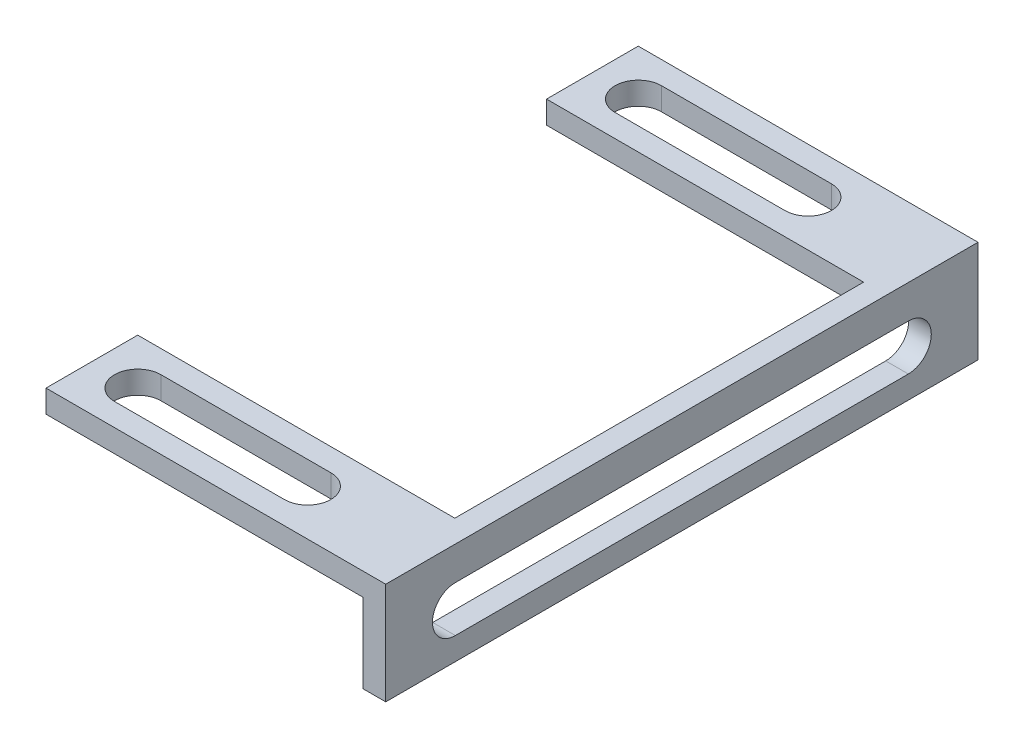
ISO-10303-21;
HEADER;
FILE_DESCRIPTION(('STEP AP214'),'2;1');
FILE_NAME('part.step','',(''),(''),'','','');
FILE_SCHEMA(('AUTOMOTIVE_DESIGN { 1 0 10303 214 1 1 1 1 }'));
ENDSEC;
DATA;
#1=APPLICATION_CONTEXT('core data for automotive mechanical design processes');
#2=APPLICATION_PROTOCOL_DEFINITION('international standard','automotive_design',2000,#1);
#3=PRODUCT_CONTEXT('',#1,'mechanical');
#4=PRODUCT('Part','Part','',(#3));
#5=PRODUCT_RELATED_PRODUCT_CATEGORY('part','',(#4));
#6=PRODUCT_DEFINITION_FORMATION('','',#4);
#7=PRODUCT_DEFINITION_CONTEXT('part definition',#1,'design');
#8=PRODUCT_DEFINITION('design','',#6,#7);
#9=PRODUCT_DEFINITION_SHAPE('','',#8);
#10=(LENGTH_UNIT() NAMED_UNIT(*) SI_UNIT(.MILLI.,.METRE.));
#11=(NAMED_UNIT(*) PLANE_ANGLE_UNIT() SI_UNIT($,.RADIAN.));
#12=(NAMED_UNIT(*) SI_UNIT($,.STERADIAN.) SOLID_ANGLE_UNIT());
#13=UNCERTAINTY_MEASURE_WITH_UNIT(LENGTH_MEASURE(1.E-05),#10,'distance_accuracy_value','');
#14=(GEOMETRIC_REPRESENTATION_CONTEXT(3) GLOBAL_UNCERTAINTY_ASSIGNED_CONTEXT((#13)) GLOBAL_UNIT_ASSIGNED_CONTEXT((#10,
#11,#12)) REPRESENTATION_CONTEXT('',''));
#15=CARTESIAN_POINT('',(0.,0.,0.));
#16=DIRECTION('',(0.,0.,1.));
#17=DIRECTION('',(1.,0.,0.));
#18=AXIS2_PLACEMENT_3D('',#15,#16,#17);
#19=CARTESIAN_POINT('',(0.,0.,-44.2));
#20=DIRECTION('',(0.,0.,-1.));
#21=DIRECTION('',(-1.,0.,0.));
#22=AXIS2_PLACEMENT_3D('',#19,#20,#21);
#23=PLANE('',#22);
#24=DIRECTION('',(0.,-1.,0.));
#25=VECTOR('',#24,1.);
#26=CARTESIAN_POINT('',(28.,2.,-44.2));
#27=LINE('',#26,#25);
#28=CARTESIAN_POINT('',(28.,2.,-44.2));
#29=VERTEX_POINT('',#28);
#30=CARTESIAN_POINT('',(28.,0.,-44.2));
#31=VERTEX_POINT('',#30);
#32=EDGE_CURVE('E57',#29,#31,#27,.T.);
#33=ORIENTED_EDGE('',*,*,#32,.F.);
#34=DIRECTION('',(-1.,0.,0.));
#35=VECTOR('',#34,1.);
#36=CARTESIAN_POINT('',(0.,2.,-44.2));
#37=LINE('',#36,#35);
#38=CARTESIAN_POINT('',(0.,2.,-44.2));
#39=VERTEX_POINT('',#38);
#40=EDGE_CURVE('E198',#29,#39,#37,.T.);
#41=ORIENTED_EDGE('',*,*,#40,.T.);
#42=DIRECTION('',(0.,1.,0.));
#43=VECTOR('',#42,1.);
#44=CARTESIAN_POINT('',(0.,0.,-44.2));
#45=LINE('',#44,#43);
#46=CARTESIAN_POINT('',(0.,0.,-44.2));
#47=VERTEX_POINT('',#46);
#48=EDGE_CURVE('E207',#47,#39,#45,.T.);
#49=ORIENTED_EDGE('',*,*,#48,.F.);
#50=DIRECTION('',(-1.,0.,0.));
#51=VECTOR('',#50,1.);
#52=CARTESIAN_POINT('',(0.,0.,-44.2));
#53=LINE('',#52,#51);
#54=EDGE_CURVE('E197',#31,#47,#53,.T.);
#55=ORIENTED_EDGE('',*,*,#54,.F.);
#56=EDGE_LOOP('',(#33,#41,#49,#55));
#57=FACE_BOUND('',#56,.T.);
#58=ADVANCED_FACE('F41',(#57),#23,.F.);
#59=CARTESIAN_POINT('',(0.,0.,-8.1));
#60=DIRECTION('',(0.,0.,1.));
#61=DIRECTION('',(1.,0.,0.));
#62=AXIS2_PLACEMENT_3D('',#59,#60,#61);
#63=PLANE('',#62);
#64=DIRECTION('',(0.,-1.,0.));
#65=VECTOR('',#64,1.);
#66=CARTESIAN_POINT('',(28.,2.,-8.1));
#67=LINE('',#66,#65);
#68=CARTESIAN_POINT('',(28.,2.,-8.1));
#69=VERTEX_POINT('',#68);
#70=CARTESIAN_POINT('',(28.,0.,-8.1));
#71=VERTEX_POINT('',#70);
#72=EDGE_CURVE('E193',#69,#71,#67,.T.);
#73=ORIENTED_EDGE('',*,*,#72,.T.);
#74=DIRECTION('',(1.,0.,0.));
#75=VECTOR('',#74,1.);
#76=CARTESIAN_POINT('',(0.,0.,-8.1));
#77=LINE('',#76,#75);
#78=CARTESIAN_POINT('',(0.,0.,-8.1));
#79=VERTEX_POINT('',#78);
#80=EDGE_CURVE('E188',#79,#71,#77,.T.);
#81=ORIENTED_EDGE('',*,*,#80,.F.);
#82=DIRECTION('',(0.,1.,0.));
#83=VECTOR('',#82,1.);
#84=CARTESIAN_POINT('',(0.,0.,-8.1));
#85=LINE('',#84,#83);
#86=CARTESIAN_POINT('',(0.,2.,-8.1));
#87=VERTEX_POINT('',#86);
#88=EDGE_CURVE('E191',#79,#87,#85,.T.);
#89=ORIENTED_EDGE('',*,*,#88,.T.);
#90=DIRECTION('',(1.,0.,0.));
#91=VECTOR('',#90,1.);
#92=CARTESIAN_POINT('',(0.,2.,-8.1));
#93=LINE('',#92,#91);
#94=EDGE_CURVE('E65',#87,#69,#93,.T.);
#95=ORIENTED_EDGE('',*,*,#94,.T.);
#96=EDGE_LOOP('',(#73,#81,#89,#95));
#97=FACE_BOUND('',#96,.T.);
#98=ADVANCED_FACE('F190',(#97),#63,.F.);
#99=CARTESIAN_POINT('',(0.,2.,0.));
#100=DIRECTION('',(1.,0.,0.));
#101=DIRECTION('',(0.,0.,-1.));
#102=AXIS2_PLACEMENT_3D('',#99,#100,#101);
#103=PLANE('',#102);
#104=ORIENTED_EDGE('',*,*,#48,.T.);
#105=DIRECTION('',(0.,0.,-1.));
#106=VECTOR('',#105,1.);
#107=CARTESIAN_POINT('',(0.,2.,0.));
#108=LINE('',#107,#106);
#109=CARTESIAN_POINT('',(0.,2.,-52.3));
#110=VERTEX_POINT('',#109);
#111=EDGE_CURVE('E247',#39,#110,#108,.T.);
#112=ORIENTED_EDGE('',*,*,#111,.T.);
#113=DIRECTION('',(0.,1.,0.));
#114=VECTOR('',#113,1.);
#115=CARTESIAN_POINT('',(0.,2.,-52.3));
#116=LINE('',#115,#114);
#117=CARTESIAN_POINT('',(0.,0.,-52.3));
#118=VERTEX_POINT('',#117);
#119=EDGE_CURVE('E253',#118,#110,#116,.T.);
#120=ORIENTED_EDGE('',*,*,#119,.F.);
#121=DIRECTION('',(0.,0.,1.));
#122=VECTOR('',#121,1.);
#123=CARTESIAN_POINT('',(0.,0.,0.));
#124=LINE('',#123,#122);
#125=EDGE_CURVE('E214',#47,#118,#124,.F.);
#126=ORIENTED_EDGE('',*,*,#125,.F.);
#127=EDGE_LOOP('',(#104,#112,#120,#126));
#128=FACE_BOUND('',#127,.T.);
#129=ADVANCED_FACE('F399',(#128),#103,.F.);
#130=CARTESIAN_POINT('',(0.,0.,0.));
#131=DIRECTION('',(0.,1.,0.));
#132=DIRECTION('',(0.,0.,1.));
#133=AXIS2_PLACEMENT_3D('',#130,#131,#132);
#134=PLANE('',#133);
#135=DIRECTION('',(1.,0.,0.));
#136=VECTOR('',#135,1.);
#137=CARTESIAN_POINT('',(0.,0.,-50.3));
#138=LINE('',#137,#136);
#139=CARTESIAN_POINT('',(4.05,0.,-50.3));
#140=VERTEX_POINT('',#139);
#141=CARTESIAN_POINT('',(19.05,0.,-50.3));
#142=VERTEX_POINT('',#141);
#143=EDGE_CURVE('E226',#140,#142,#138,.T.);
#144=ORIENTED_EDGE('',*,*,#143,.F.);
#145=CARTESIAN_POINT('',(4.05,0.,-48.25));
#146=DIRECTION('',(0.,1.,0.));
#147=DIRECTION('',(0.,0.,1.));
#148=AXIS2_PLACEMENT_3D('',#145,#146,#147);
#149=CIRCLE('',#148,2.05);
#150=CARTESIAN_POINT('',(4.05,0.,-46.2));
#151=VERTEX_POINT('',#150);
#152=EDGE_CURVE('E232',#151,#140,#149,.F.);
#153=ORIENTED_EDGE('',*,*,#152,.F.);
#154=DIRECTION('',(1.,0.,0.));
#155=VECTOR('',#154,1.);
#156=CARTESIAN_POINT('',(0.,0.,-46.2));
#157=LINE('',#156,#155);
#158=CARTESIAN_POINT('',(19.05,0.,-46.2));
#159=VERTEX_POINT('',#158);
#160=EDGE_CURVE('E236',#151,#159,#157,.T.);
#161=ORIENTED_EDGE('',*,*,#160,.T.);
#162=CARTESIAN_POINT('',(19.05,0.,-48.25));
#163=DIRECTION('',(0.,1.,0.));
#164=DIRECTION('',(0.,0.,1.));
#165=AXIS2_PLACEMENT_3D('',#162,#163,#164);
#166=CIRCLE('',#165,2.05);
#167=EDGE_CURVE('E231',#142,#159,#166,.F.);
#168=ORIENTED_EDGE('',*,*,#167,.F.);
#169=EDGE_LOOP('',(#144,#153,#161,#168));
#170=FACE_BOUND('',#169,.T.);
#171=DIRECTION('',(0.,0.,1.));
#172=VECTOR('',#171,1.);
#173=CARTESIAN_POINT('',(28.,0.,0.));
#174=LINE('',#173,#172);
#175=CARTESIAN_POINT('',(28.,0.,-52.3));
#176=VERTEX_POINT('',#175);
#177=EDGE_CURVE('E216',#31,#176,#174,.F.);
#178=ORIENTED_EDGE('',*,*,#177,.F.);
#179=ORIENTED_EDGE('',*,*,#54,.T.);
#180=ORIENTED_EDGE('',*,*,#125,.T.);
#181=DIRECTION('',(1.,0.,0.));
#182=VECTOR('',#181,1.);
#183=CARTESIAN_POINT('',(0.,0.,-52.3));
#184=LINE('',#183,#182);
#185=EDGE_CURVE('E223',#118,#176,#184,.T.);
#186=ORIENTED_EDGE('',*,*,#185,.T.);
#187=EDGE_LOOP('',(#178,#179,#180,#186));
#188=FACE_BOUND('',#187,.T.);
#189=ADVANCED_FACE('F403',(#170,#188),#134,.F.);
#190=CARTESIAN_POINT('',(4.05,2.,-4.05));
#191=DIRECTION('',(0.,1.,0.));
#192=DIRECTION('',(0.,0.,1.));
#193=AXIS2_PLACEMENT_3D('',#190,#191,#192);
#194=CYLINDRICAL_SURFACE('',#193,2.05);
#195=DIRECTION('',(0.,1.,0.));
#196=VECTOR('',#195,1.);
#197=CARTESIAN_POINT('',(4.05,2.,-2.));
#198=LINE('',#197,#196);
#199=CARTESIAN_POINT('',(4.05,0.,-2.));
#200=VERTEX_POINT('',#199);
#201=CARTESIAN_POINT('',(4.05,2.,-2.));
#202=VERTEX_POINT('',#201);
#203=EDGE_CURVE('E11',#200,#202,#198,.T.);
#204=ORIENTED_EDGE('',*,*,#203,.F.);
#205=CARTESIAN_POINT('',(4.05,0.,-4.05));
#206=DIRECTION('',(0.,1.,0.));
#207=DIRECTION('',(0.,0.,1.));
#208=AXIS2_PLACEMENT_3D('',#205,#206,#207);
#209=CIRCLE('',#208,2.05);
#210=CARTESIAN_POINT('',(4.05,0.,-6.1));
#211=VERTEX_POINT('',#210);
#212=EDGE_CURVE('E248',#211,#200,#209,.T.);
#213=ORIENTED_EDGE('',*,*,#212,.F.);
#214=DIRECTION('',(0.,1.,0.));
#215=VECTOR('',#214,1.);
#216=CARTESIAN_POINT('',(4.05,2.,-6.1));
#217=LINE('',#216,#215);
#218=CARTESIAN_POINT('',(4.05,2.,-6.1));
#219=VERTEX_POINT('',#218);
#220=EDGE_CURVE('E50',#211,#219,#217,.T.);
#221=ORIENTED_EDGE('',*,*,#220,.T.);
#222=CARTESIAN_POINT('',(4.05,2.,-4.05));
#223=DIRECTION('',(0.,1.,0.));
#224=DIRECTION('',(0.,0.,1.));
#225=AXIS2_PLACEMENT_3D('',#222,#223,#224);
#226=CIRCLE('',#225,2.05);
#227=EDGE_CURVE('E273',#219,#202,#226,.T.);
#228=ORIENTED_EDGE('',*,*,#227,.T.);
#229=EDGE_LOOP('',(#204,#213,#221,#228));
#230=FACE_BOUND('',#229,.T.);
#231=ADVANCED_FACE('F272',(#230),#194,.F.);
#232=CARTESIAN_POINT('',(0.,2.,-6.1));
#233=DIRECTION('',(0.,0.,1.));
#234=DIRECTION('',(1.,0.,0.));
#235=AXIS2_PLACEMENT_3D('',#232,#233,#234);
#236=PLANE('',#235);
#237=ORIENTED_EDGE('',*,*,#220,.F.);
#238=DIRECTION('',(1.,0.,0.));
#239=VECTOR('',#238,1.);
#240=CARTESIAN_POINT('',(0.,0.,-6.1));
#241=LINE('',#240,#239);
#242=CARTESIAN_POINT('',(19.05,0.,-6.1));
#243=VERTEX_POINT('',#242);
#244=EDGE_CURVE('E244',#211,#243,#241,.T.);
#245=ORIENTED_EDGE('',*,*,#244,.T.);
#246=DIRECTION('',(0.,1.,0.));
#247=VECTOR('',#246,1.);
#248=CARTESIAN_POINT('',(19.05,2.,-6.1));
#249=LINE('',#248,#247);
#250=CARTESIAN_POINT('',(19.05,2.,-6.1));
#251=VERTEX_POINT('',#250);
#252=EDGE_CURVE('E266',#243,#251,#249,.T.);
#253=ORIENTED_EDGE('',*,*,#252,.T.);
#254=DIRECTION('',(1.,0.,0.));
#255=VECTOR('',#254,1.);
#256=CARTESIAN_POINT('',(0.,2.,-6.1));
#257=LINE('',#256,#255);
#258=EDGE_CURVE('E221',#219,#251,#257,.T.);
#259=ORIENTED_EDGE('',*,*,#258,.F.);
#260=EDGE_LOOP('',(#237,#245,#253,#259));
#261=FACE_BOUND('',#260,.T.);
#262=ADVANCED_FACE('F285',(#261),#236,.T.);
#263=CARTESIAN_POINT('',(19.05,2.,-4.05));
#264=DIRECTION('',(0.,1.,0.));
#265=DIRECTION('',(0.,0.,1.));
#266=AXIS2_PLACEMENT_3D('',#263,#264,#265);
#267=CYLINDRICAL_SURFACE('',#266,2.05);
#268=ORIENTED_EDGE('',*,*,#252,.F.);
#269=CARTESIAN_POINT('',(19.05,0.,-4.05));
#270=DIRECTION('',(0.,1.,0.));
#271=DIRECTION('',(0.,0.,1.));
#272=AXIS2_PLACEMENT_3D('',#269,#270,#271);
#273=CIRCLE('',#272,2.05);
#274=CARTESIAN_POINT('',(19.05,0.,-2.));
#275=VERTEX_POINT('',#274);
#276=EDGE_CURVE('E235',#275,#243,#273,.T.);
#277=ORIENTED_EDGE('',*,*,#276,.F.);
#278=DIRECTION('',(0.,1.,0.));
#279=VECTOR('',#278,1.);
#280=CARTESIAN_POINT('',(19.05,2.,-2.));
#281=LINE('',#280,#279);
#282=CARTESIAN_POINT('',(19.05,2.,-2.));
#283=VERTEX_POINT('',#282);
#284=EDGE_CURVE('E45',#275,#283,#281,.T.);
#285=ORIENTED_EDGE('',*,*,#284,.T.);
#286=CARTESIAN_POINT('',(19.05,2.,-4.05));
#287=DIRECTION('',(0.,1.,0.));
#288=DIRECTION('',(0.,0.,1.));
#289=AXIS2_PLACEMENT_3D('',#286,#287,#288);
#290=CIRCLE('',#289,2.05);
#291=EDGE_CURVE('E289',#283,#251,#290,.T.);
#292=ORIENTED_EDGE('',*,*,#291,.T.);
#293=EDGE_LOOP('',(#268,#277,#285,#292));
#294=FACE_BOUND('',#293,.T.);
#295=ADVANCED_FACE('F290',(#294),#267,.F.);
#296=CARTESIAN_POINT('',(0.,2.,-46.2));
#297=DIRECTION('',(0.,0.,1.));
#298=DIRECTION('',(1.,0.,0.));
#299=AXIS2_PLACEMENT_3D('',#296,#297,#298);
#300=PLANE('',#299);
#301=DIRECTION('',(0.,1.,0.));
#302=VECTOR('',#301,1.);
#303=CARTESIAN_POINT('',(19.05,2.,-46.2));
#304=LINE('',#303,#302);
#305=CARTESIAN_POINT('',(19.05,2.,-46.2));
#306=VERTEX_POINT('',#305);
#307=EDGE_CURVE('E263',#159,#306,#304,.T.);
#308=ORIENTED_EDGE('',*,*,#307,.F.);
#309=ORIENTED_EDGE('',*,*,#160,.F.);
#310=DIRECTION('',(0.,1.,0.));
#311=VECTOR('',#310,1.);
#312=CARTESIAN_POINT('',(4.05,2.,-46.2));
#313=LINE('',#312,#311);
#314=CARTESIAN_POINT('',(4.05,2.,-46.2));
#315=VERTEX_POINT('',#314);
#316=EDGE_CURVE('E261',#151,#315,#313,.T.);
#317=ORIENTED_EDGE('',*,*,#316,.T.);
#318=DIRECTION('',(1.,0.,0.));
#319=VECTOR('',#318,1.);
#320=CARTESIAN_POINT('',(0.,2.,-46.2));
#321=LINE('',#320,#319);
#322=EDGE_CURVE('E295',#315,#306,#321,.T.);
#323=ORIENTED_EDGE('',*,*,#322,.T.);
#324=EDGE_LOOP('',(#308,#309,#317,#323));
#325=FACE_BOUND('',#324,.T.);
#326=ADVANCED_FACE('F472',(#325),#300,.F.);
#327=CARTESIAN_POINT('',(4.05,2.,-48.25));
#328=DIRECTION('',(0.,1.,0.));
#329=DIRECTION('',(0.,0.,1.));
#330=AXIS2_PLACEMENT_3D('',#327,#328,#329);
#331=CYLINDRICAL_SURFACE('',#330,2.05);
#332=ORIENTED_EDGE('',*,*,#316,.F.);
#333=ORIENTED_EDGE('',*,*,#152,.T.);
#334=DIRECTION('',(0.,1.,0.));
#335=VECTOR('',#334,1.);
#336=CARTESIAN_POINT('',(4.05,2.,-50.3));
#337=LINE('',#336,#335);
#338=CARTESIAN_POINT('',(4.05,2.,-50.3));
#339=VERTEX_POINT('',#338);
#340=EDGE_CURVE('E259',#140,#339,#337,.T.);
#341=ORIENTED_EDGE('',*,*,#340,.T.);
#342=CARTESIAN_POINT('',(4.05,2.,-48.25));
#343=DIRECTION('',(0.,1.,0.));
#344=DIRECTION('',(0.,0.,1.));
#345=AXIS2_PLACEMENT_3D('',#342,#343,#344);
#346=CIRCLE('',#345,2.05);
#347=EDGE_CURVE('E291',#315,#339,#346,.F.);
#348=ORIENTED_EDGE('',*,*,#347,.F.);
#349=EDGE_LOOP('',(#332,#333,#341,#348));
#350=FACE_BOUND('',#349,.T.);
#351=ADVANCED_FACE('F466',(#350),#331,.F.);
#352=CARTESIAN_POINT('',(0.,2.,-50.3));
#353=DIRECTION('',(0.,0.,1.));
#354=DIRECTION('',(1.,0.,0.));
#355=AXIS2_PLACEMENT_3D('',#352,#353,#354);
#356=PLANE('',#355);
#357=ORIENTED_EDGE('',*,*,#340,.F.);
#358=ORIENTED_EDGE('',*,*,#143,.T.);
#359=DIRECTION('',(0.,1.,0.));
#360=VECTOR('',#359,1.);
#361=CARTESIAN_POINT('',(19.05,2.,-50.3));
#362=LINE('',#361,#360);
#363=CARTESIAN_POINT('',(19.05,2.,-50.3));
#364=VERTEX_POINT('',#363);
#365=EDGE_CURVE('E256',#142,#364,#362,.T.);
#366=ORIENTED_EDGE('',*,*,#365,.T.);
#367=DIRECTION('',(1.,0.,0.));
#368=VECTOR('',#367,1.);
#369=CARTESIAN_POINT('',(0.,2.,-50.3));
#370=LINE('',#369,#368);
#371=EDGE_CURVE('E303',#339,#364,#370,.T.);
#372=ORIENTED_EDGE('',*,*,#371,.F.);
#373=EDGE_LOOP('',(#357,#358,#366,#372));
#374=FACE_BOUND('',#373,.T.);
#375=ADVANCED_FACE('F476',(#374),#356,.T.);
#376=CARTESIAN_POINT('',(0.,2.,-52.3));
#377=DIRECTION('',(0.,0.,1.));
#378=DIRECTION('',(1.,0.,0.));
#379=AXIS2_PLACEMENT_3D('',#376,#377,#378);
#380=PLANE('',#379);
#381=DIRECTION('',(1.,0.,0.));
#382=VECTOR('',#381,1.);
#383=CARTESIAN_POINT('',(0.,2.,-52.3));
#384=LINE('',#383,#382);
#385=CARTESIAN_POINT('',(30.,2.,-52.3));
#386=VERTEX_POINT('',#385);
#387=EDGE_CURVE('E306',#110,#386,#384,.T.);
#388=ORIENTED_EDGE('',*,*,#387,.T.);
#389=DIRECTION('',(0.,1.,0.));
#390=VECTOR('',#389,1.);
#391=CARTESIAN_POINT('',(30.,2.,-52.3));
#392=LINE('',#391,#390);
#393=CARTESIAN_POINT('',(30.,-7.,-52.3));
#394=VERTEX_POINT('',#393);
#395=EDGE_CURVE('E328',#394,#386,#392,.T.);
#396=ORIENTED_EDGE('',*,*,#395,.F.);
#397=DIRECTION('',(-1.,0.,0.));
#398=VECTOR('',#397,1.);
#399=CARTESIAN_POINT('',(30.,-7.,-52.3));
#400=LINE('',#399,#398);
#401=CARTESIAN_POINT('',(28.,-7.,-52.3));
#402=VERTEX_POINT('',#401);
#403=EDGE_CURVE('E314',#394,#402,#400,.T.);
#404=ORIENTED_EDGE('',*,*,#403,.T.);
#405=DIRECTION('',(0.,1.,0.));
#406=VECTOR('',#405,1.);
#407=CARTESIAN_POINT('',(28.,2.,-52.3));
#408=LINE('',#407,#406);
#409=EDGE_CURVE('E318',#402,#176,#408,.T.);
#410=ORIENTED_EDGE('',*,*,#409,.T.);
#411=ORIENTED_EDGE('',*,*,#185,.F.);
#412=ORIENTED_EDGE('',*,*,#119,.T.);
#413=EDGE_LOOP('',(#388,#396,#404,#410,#411,#412));
#414=FACE_BOUND('',#413,.T.);
#415=ADVANCED_FACE('F394',(#414),#380,.F.);
#416=ORIENTED_EDGE('',*,*,#88,.F.);
#417=CARTESIAN_POINT('',(0.,0.,0.));
#418=VERTEX_POINT('',#417);
#419=EDGE_CURVE('E204',#418,#79,#124,.F.);
#420=ORIENTED_EDGE('',*,*,#419,.F.);
#421=DIRECTION('',(0.,1.,0.));
#422=VECTOR('',#421,1.);
#423=CARTESIAN_POINT('',(0.,2.,0.));
#424=LINE('',#423,#422);
#425=CARTESIAN_POINT('',(0.,2.,0.));
#426=VERTEX_POINT('',#425);
#427=EDGE_CURVE('E257',#418,#426,#424,.T.);
#428=ORIENTED_EDGE('',*,*,#427,.T.);
#429=EDGE_CURVE('E206',#426,#87,#108,.T.);
#430=ORIENTED_EDGE('',*,*,#429,.T.);
#431=EDGE_LOOP('',(#416,#420,#428,#430));
#432=FACE_BOUND('',#431,.T.);
#433=ADVANCED_FACE('F203',(#432),#103,.F.);
#434=CARTESIAN_POINT('',(0.,2.,0.));
#435=DIRECTION('',(0.,0.,1.));
#436=DIRECTION('',(1.,0.,0.));
#437=AXIS2_PLACEMENT_3D('',#434,#435,#436);
#438=PLANE('',#437);
#439=DIRECTION('',(1.,0.,0.));
#440=VECTOR('',#439,1.);
#441=CARTESIAN_POINT('',(0.,0.,0.));
#442=LINE('',#441,#440);
#443=CARTESIAN_POINT('',(28.,0.,0.));
#444=VERTEX_POINT('',#443);
#445=EDGE_CURVE('E213',#418,#444,#442,.T.);
#446=ORIENTED_EDGE('',*,*,#445,.T.);
#447=DIRECTION('',(0.,-1.,0.));
#448=VECTOR('',#447,1.);
#449=CARTESIAN_POINT('',(28.,2.,0.));
#450=LINE('',#449,#448);
#451=CARTESIAN_POINT('',(28.,-7.,0.));
#452=VERTEX_POINT('',#451);
#453=EDGE_CURVE('E324',#444,#452,#450,.T.);
#454=ORIENTED_EDGE('',*,*,#453,.T.);
#455=DIRECTION('',(-1.,0.,0.));
#456=VECTOR('',#455,1.);
#457=CARTESIAN_POINT('',(30.,-7.,0.));
#458=LINE('',#457,#456);
#459=CARTESIAN_POINT('',(30.,-7.,0.));
#460=VERTEX_POINT('',#459);
#461=EDGE_CURVE('E218',#460,#452,#458,.T.);
#462=ORIENTED_EDGE('',*,*,#461,.F.);
#463=DIRECTION('',(0.,-1.,0.));
#464=VECTOR('',#463,1.);
#465=CARTESIAN_POINT('',(30.,2.,0.));
#466=LINE('',#465,#464);
#467=CARTESIAN_POINT('',(30.,2.,0.));
#468=VERTEX_POINT('',#467);
#469=EDGE_CURVE('E321',#468,#460,#466,.T.);
#470=ORIENTED_EDGE('',*,*,#469,.F.);
#471=DIRECTION('',(1.,0.,0.));
#472=VECTOR('',#471,1.);
#473=CARTESIAN_POINT('',(0.,2.,0.));
#474=LINE('',#473,#472);
#475=EDGE_CURVE('E308',#426,#468,#474,.T.);
#476=ORIENTED_EDGE('',*,*,#475,.F.);
#477=ORIENTED_EDGE('',*,*,#427,.F.);
#478=EDGE_LOOP('',(#446,#454,#462,#470,#476,#477));
#479=FACE_BOUND('',#478,.T.);
#480=ADVANCED_FACE('F382',(#479),#438,.T.);
#481=CARTESIAN_POINT('',(19.05,2.,-48.25));
#482=DIRECTION('',(0.,1.,0.));
#483=DIRECTION('',(0.,0.,1.));
#484=AXIS2_PLACEMENT_3D('',#481,#482,#483);
#485=CYLINDRICAL_SURFACE('',#484,2.05);
#486=ORIENTED_EDGE('',*,*,#167,.T.);
#487=ORIENTED_EDGE('',*,*,#307,.T.);
#488=CARTESIAN_POINT('',(19.05,2.,-48.25));
#489=DIRECTION('',(0.,1.,0.));
#490=DIRECTION('',(0.,0.,1.));
#491=AXIS2_PLACEMENT_3D('',#488,#489,#490);
#492=CIRCLE('',#491,2.05);
#493=EDGE_CURVE('E300',#364,#306,#492,.F.);
#494=ORIENTED_EDGE('',*,*,#493,.F.);
#495=ORIENTED_EDGE('',*,*,#365,.F.);
#496=EDGE_LOOP('',(#486,#487,#494,#495));
#497=FACE_BOUND('',#496,.T.);
#498=ADVANCED_FACE('F474',(#497),#485,.F.);
#499=CARTESIAN_POINT('',(0.,2.,-2.));
#500=DIRECTION('',(0.,0.,1.));
#501=DIRECTION('',(1.,0.,0.));
#502=AXIS2_PLACEMENT_3D('',#499,#500,#501);
#503=PLANE('',#502);
#504=DIRECTION('',(1.,0.,0.));
#505=VECTOR('',#504,1.);
#506=CARTESIAN_POINT('',(0.,0.,-2.));
#507=LINE('',#506,#505);
#508=EDGE_CURVE('E243',#200,#275,#507,.T.);
#509=ORIENTED_EDGE('',*,*,#508,.F.);
#510=ORIENTED_EDGE('',*,*,#203,.T.);
#511=DIRECTION('',(1.,0.,0.));
#512=VECTOR('',#511,1.);
#513=CARTESIAN_POINT('',(0.,2.,-2.));
#514=LINE('',#513,#512);
#515=EDGE_CURVE('E284',#202,#283,#514,.T.);
#516=ORIENTED_EDGE('',*,*,#515,.T.);
#517=ORIENTED_EDGE('',*,*,#284,.F.);
#518=EDGE_LOOP('',(#509,#510,#516,#517));
#519=FACE_BOUND('',#518,.T.);
#520=ADVANCED_FACE('F43',(#519),#503,.F.);
#521=CARTESIAN_POINT('',(0.,2.,0.));
#522=DIRECTION('',(0.,1.,0.));
#523=DIRECTION('',(0.,0.,1.));
#524=AXIS2_PLACEMENT_3D('',#521,#522,#523);
#525=PLANE('',#524);
#526=ORIENTED_EDGE('',*,*,#94,.F.);
#527=ORIENTED_EDGE('',*,*,#429,.F.);
#528=ORIENTED_EDGE('',*,*,#475,.T.);
#529=DIRECTION('',(0.,0.,1.));
#530=VECTOR('',#529,1.);
#531=CARTESIAN_POINT('',(30.,2.,0.));
#532=LINE('',#531,#530);
#533=EDGE_CURVE('E317',#386,#468,#532,.T.);
#534=ORIENTED_EDGE('',*,*,#533,.F.);
#535=ORIENTED_EDGE('',*,*,#387,.F.);
#536=ORIENTED_EDGE('',*,*,#111,.F.);
#537=ORIENTED_EDGE('',*,*,#40,.F.);
#538=DIRECTION('',(0.,0.,1.));
#539=VECTOR('',#538,1.);
#540=CARTESIAN_POINT('',(28.,2.,-44.2));
#541=LINE('',#540,#539);
#542=EDGE_CURVE('E373',#29,#69,#541,.T.);
#543=ORIENTED_EDGE('',*,*,#542,.T.);
#544=EDGE_LOOP('',(#526,#527,#528,#534,#535,#536,#537,#543));
#545=FACE_BOUND('',#544,.T.);
#546=ORIENTED_EDGE('',*,*,#291,.F.);
#547=ORIENTED_EDGE('',*,*,#515,.F.);
#548=ORIENTED_EDGE('',*,*,#227,.F.);
#549=ORIENTED_EDGE('',*,*,#258,.T.);
#550=EDGE_LOOP('',(#546,#547,#548,#549));
#551=FACE_BOUND('',#550,.T.);
#552=ORIENTED_EDGE('',*,*,#371,.T.);
#553=ORIENTED_EDGE('',*,*,#493,.T.);
#554=ORIENTED_EDGE('',*,*,#322,.F.);
#555=ORIENTED_EDGE('',*,*,#347,.T.);
#556=EDGE_LOOP('',(#552,#553,#554,#555));
#557=FACE_BOUND('',#556,.T.);
#558=ADVANCED_FACE('F281',(#545,#551,#557),#525,.T.);
#559=ORIENTED_EDGE('',*,*,#419,.T.);
#560=ORIENTED_EDGE('',*,*,#80,.T.);
#561=EDGE_CURVE('E227',#444,#71,#174,.F.);
#562=ORIENTED_EDGE('',*,*,#561,.F.);
#563=ORIENTED_EDGE('',*,*,#445,.F.);
#564=EDGE_LOOP('',(#559,#560,#562,#563));
#565=FACE_BOUND('',#564,.T.);
#566=ORIENTED_EDGE('',*,*,#276,.T.);
#567=ORIENTED_EDGE('',*,*,#244,.F.);
#568=ORIENTED_EDGE('',*,*,#212,.T.);
#569=ORIENTED_EDGE('',*,*,#508,.T.);
#570=EDGE_LOOP('',(#566,#567,#568,#569));
#571=FACE_BOUND('',#570,.T.);
#572=ADVANCED_FACE('F210',(#565,#571),#134,.F.);
#573=CARTESIAN_POINT('',(28.,0.,0.));
#574=DIRECTION('',(1.,0.,0.));
#575=DIRECTION('',(0.,0.,-1.));
#576=AXIS2_PLACEMENT_3D('',#573,#574,#575);
#577=PLANE('',#576);
#578=CARTESIAN_POINT('',(28.,-2.975,-6.15));
#579=DIRECTION('',(1.,0.,0.));
#580=DIRECTION('',(0.,0.,-1.));
#581=AXIS2_PLACEMENT_3D('',#578,#579,#580);
#582=CIRCLE('',#581,2.025);
#583=CARTESIAN_POINT('',(28.,-0.95,-6.15));
#584=VERTEX_POINT('',#583);
#585=CARTESIAN_POINT('',(28.,-5.,-6.15));
#586=VERTEX_POINT('',#585);
#587=EDGE_CURVE('E355',#584,#586,#582,.T.);
#588=ORIENTED_EDGE('',*,*,#587,.T.);
#589=DIRECTION('',(0.,0.,-1.));
#590=VECTOR('',#589,1.);
#591=CARTESIAN_POINT('',(28.,-5.,-6.15));
#592=LINE('',#591,#590);
#593=CARTESIAN_POINT('',(28.,-5.,-46.15));
#594=VERTEX_POINT('',#593);
#595=EDGE_CURVE('E352',#586,#594,#592,.T.);
#596=ORIENTED_EDGE('',*,*,#595,.T.);
#597=CARTESIAN_POINT('',(28.,-2.975,-46.15));
#598=DIRECTION('',(1.,0.,0.));
#599=DIRECTION('',(0.,0.,-1.));
#600=AXIS2_PLACEMENT_3D('',#597,#598,#599);
#601=CIRCLE('',#600,2.025);
#602=CARTESIAN_POINT('',(28.,-0.95,-46.15));
#603=VERTEX_POINT('',#602);
#604=EDGE_CURVE('E349',#594,#603,#601,.T.);
#605=ORIENTED_EDGE('',*,*,#604,.T.);
#606=DIRECTION('',(0.,0.,1.));
#607=VECTOR('',#606,1.);
#608=CARTESIAN_POINT('',(28.,-0.95,-6.15));
#609=LINE('',#608,#607);
#610=EDGE_CURVE('E345',#603,#584,#609,.T.);
#611=ORIENTED_EDGE('',*,*,#610,.T.);
#612=EDGE_LOOP('',(#588,#596,#605,#611));
#613=FACE_BOUND('',#612,.T.);
#614=ORIENTED_EDGE('',*,*,#453,.F.);
#615=ORIENTED_EDGE('',*,*,#561,.T.);
#616=ORIENTED_EDGE('',*,*,#72,.F.);
#617=ORIENTED_EDGE('',*,*,#542,.F.);
#618=ORIENTED_EDGE('',*,*,#32,.T.);
#619=ORIENTED_EDGE('',*,*,#177,.T.);
#620=ORIENTED_EDGE('',*,*,#409,.F.);
#621=DIRECTION('',(0.,0.,-1.));
#622=VECTOR('',#621,1.);
#623=CARTESIAN_POINT('',(28.,-7.,0.));
#624=LINE('',#623,#622);
#625=EDGE_CURVE('E322',#452,#402,#624,.T.);
#626=ORIENTED_EDGE('',*,*,#625,.F.);
#627=EDGE_LOOP('',(#614,#615,#616,#617,#618,#619,#620,#626));
#628=FACE_BOUND('',#627,.T.);
#629=ADVANCED_FACE('F379',(#613,#628),#577,.F.);
#630=CARTESIAN_POINT('',(30.,0.,0.));
#631=DIRECTION('',(1.,0.,0.));
#632=DIRECTION('',(0.,0.,-1.));
#633=AXIS2_PLACEMENT_3D('',#630,#631,#632);
#634=PLANE('',#633);
#635=ORIENTED_EDGE('',*,*,#533,.T.);
#636=ORIENTED_EDGE('',*,*,#469,.T.);
#637=DIRECTION('',(0.,0.,-1.));
#638=VECTOR('',#637,1.);
#639=CARTESIAN_POINT('',(30.,-7.,0.));
#640=LINE('',#639,#638);
#641=EDGE_CURVE('E331',#460,#394,#640,.T.);
#642=ORIENTED_EDGE('',*,*,#641,.T.);
#643=ORIENTED_EDGE('',*,*,#395,.T.);
#644=EDGE_LOOP('',(#635,#636,#642,#643));
#645=FACE_BOUND('',#644,.T.);
#646=DIRECTION('',(0.,0.,-1.));
#647=VECTOR('',#646,1.);
#648=CARTESIAN_POINT('',(30.,-5.,-6.15));
#649=LINE('',#648,#647);
#650=CARTESIAN_POINT('',(30.,-5.,-6.15));
#651=VERTEX_POINT('',#650);
#652=CARTESIAN_POINT('',(30.,-5.,-46.15));
#653=VERTEX_POINT('',#652);
#654=EDGE_CURVE('E362',#651,#653,#649,.T.);
#655=ORIENTED_EDGE('',*,*,#654,.F.);
#656=CARTESIAN_POINT('',(30.,-2.975,-6.15));
#657=DIRECTION('',(1.,0.,0.));
#658=DIRECTION('',(0.,0.,-1.));
#659=AXIS2_PLACEMENT_3D('',#656,#657,#658);
#660=CIRCLE('',#659,2.025);
#661=CARTESIAN_POINT('',(30.,-0.95,-6.15));
#662=VERTEX_POINT('',#661);
#663=EDGE_CURVE('E348',#662,#651,#660,.T.);
#664=ORIENTED_EDGE('',*,*,#663,.F.);
#665=DIRECTION('',(0.,0.,1.));
#666=VECTOR('',#665,1.);
#667=CARTESIAN_POINT('',(30.,-0.95,-6.15));
#668=LINE('',#667,#666);
#669=CARTESIAN_POINT('',(30.,-0.95,-46.15));
#670=VERTEX_POINT('',#669);
#671=EDGE_CURVE('E344',#670,#662,#668,.T.);
#672=ORIENTED_EDGE('',*,*,#671,.F.);
#673=CARTESIAN_POINT('',(30.,-2.975,-46.15));
#674=DIRECTION('',(1.,0.,0.));
#675=DIRECTION('',(0.,0.,-1.));
#676=AXIS2_PLACEMENT_3D('',#673,#674,#675);
#677=CIRCLE('',#676,2.025);
#678=EDGE_CURVE('E359',#653,#670,#677,.T.);
#679=ORIENTED_EDGE('',*,*,#678,.F.);
#680=EDGE_LOOP('',(#655,#664,#672,#679));
#681=FACE_BOUND('',#680,.T.);
#682=ADVANCED_FACE('F389',(#645,#681),#634,.T.);
#683=CARTESIAN_POINT('',(30.,-7.,0.));
#684=DIRECTION('',(0.,1.,0.));
#685=DIRECTION('',(0.,0.,1.));
#686=AXIS2_PLACEMENT_3D('',#683,#684,#685);
#687=PLANE('',#686);
#688=ORIENTED_EDGE('',*,*,#625,.T.);
#689=ORIENTED_EDGE('',*,*,#403,.F.);
#690=ORIENTED_EDGE('',*,*,#641,.F.);
#691=ORIENTED_EDGE('',*,*,#461,.T.);
#692=EDGE_LOOP('',(#688,#689,#690,#691));
#693=FACE_BOUND('',#692,.T.);
#694=ADVANCED_FACE('F405',(#693),#687,.F.);
#695=CARTESIAN_POINT('',(30.,-2.975,-6.15));
#696=DIRECTION('',(-1.,0.,0.));
#697=DIRECTION('',(0.,0.,1.));
#698=AXIS2_PLACEMENT_3D('',#695,#696,#697);
#699=CYLINDRICAL_SURFACE('',#698,2.025);
#700=ORIENTED_EDGE('',*,*,#587,.F.);
#701=DIRECTION('',(-1.,0.,0.));
#702=VECTOR('',#701,1.);
#703=CARTESIAN_POINT('',(30.,-0.95,-6.15));
#704=LINE('',#703,#702);
#705=EDGE_CURVE('E341',#662,#584,#704,.T.);
#706=ORIENTED_EDGE('',*,*,#705,.F.);
#707=ORIENTED_EDGE('',*,*,#663,.T.);
#708=DIRECTION('',(-1.,0.,0.));
#709=VECTOR('',#708,1.);
#710=CARTESIAN_POINT('',(30.,-5.,-6.15));
#711=LINE('',#710,#709);
#712=EDGE_CURVE('E326',#651,#586,#711,.T.);
#713=ORIENTED_EDGE('',*,*,#712,.T.);
#714=EDGE_LOOP('',(#700,#706,#707,#713));
#715=FACE_BOUND('',#714,.T.);
#716=ADVANCED_FACE('F407',(#715),#699,.F.);
#717=CARTESIAN_POINT('',(30.,-5.,-6.15));
#718=DIRECTION('',(0.,1.,0.));
#719=DIRECTION('',(0.,0.,1.));
#720=AXIS2_PLACEMENT_3D('',#717,#718,#719);
#721=PLANE('',#720);
#722=ORIENTED_EDGE('',*,*,#595,.F.);
#723=ORIENTED_EDGE('',*,*,#712,.F.);
#724=ORIENTED_EDGE('',*,*,#654,.T.);
#725=DIRECTION('',(-1.,0.,0.));
#726=VECTOR('',#725,1.);
#727=CARTESIAN_POINT('',(30.,-5.,-46.15));
#728=LINE('',#727,#726);
#729=EDGE_CURVE('E337',#653,#594,#728,.T.);
#730=ORIENTED_EDGE('',*,*,#729,.T.);
#731=EDGE_LOOP('',(#722,#723,#724,#730));
#732=FACE_BOUND('',#731,.T.);
#733=ADVANCED_FACE('F413',(#732),#721,.T.);
#734=CARTESIAN_POINT('',(30.,-2.975,-46.15));
#735=DIRECTION('',(-1.,0.,0.));
#736=DIRECTION('',(0.,0.,1.));
#737=AXIS2_PLACEMENT_3D('',#734,#735,#736);
#738=CYLINDRICAL_SURFACE('',#737,2.025);
#739=ORIENTED_EDGE('',*,*,#604,.F.);
#740=ORIENTED_EDGE('',*,*,#729,.F.);
#741=ORIENTED_EDGE('',*,*,#678,.T.);
#742=DIRECTION('',(-1.,0.,0.));
#743=VECTOR('',#742,1.);
#744=CARTESIAN_POINT('',(30.,-0.95,-46.15));
#745=LINE('',#744,#743);
#746=EDGE_CURVE('E339',#670,#603,#745,.T.);
#747=ORIENTED_EDGE('',*,*,#746,.T.);
#748=EDGE_LOOP('',(#739,#740,#741,#747));
#749=FACE_BOUND('',#748,.T.);
#750=ADVANCED_FACE('F429',(#749),#738,.F.);
#751=CARTESIAN_POINT('',(30.,-0.95,-6.15));
#752=DIRECTION('',(0.,-1.,0.));
#753=DIRECTION('',(0.,0.,-1.));
#754=AXIS2_PLACEMENT_3D('',#751,#752,#753);
#755=PLANE('',#754);
#756=ORIENTED_EDGE('',*,*,#610,.F.);
#757=ORIENTED_EDGE('',*,*,#746,.F.);
#758=ORIENTED_EDGE('',*,*,#671,.T.);
#759=ORIENTED_EDGE('',*,*,#705,.T.);
#760=EDGE_LOOP('',(#756,#757,#758,#759));
#761=FACE_BOUND('',#760,.T.);
#762=ADVANCED_FACE('F426',(#761),#755,.T.);
#763=CLOSED_SHELL('',(#58,#98,#129,#189,#231,#262,#295,#326,#351,#375,#415,#433,#480,#498,#520,
#558,#572,#629,#682,#694,#716,#733,#750,#762));
#764=MANIFOLD_SOLID_BREP('B2',#763);
#765=ADVANCED_BREP_SHAPE_REPRESENTATION('',(#18,#764),#14);
#766=SHAPE_DEFINITION_REPRESENTATION(#9,#765);
ENDSEC;
END-ISO-10303-21;
